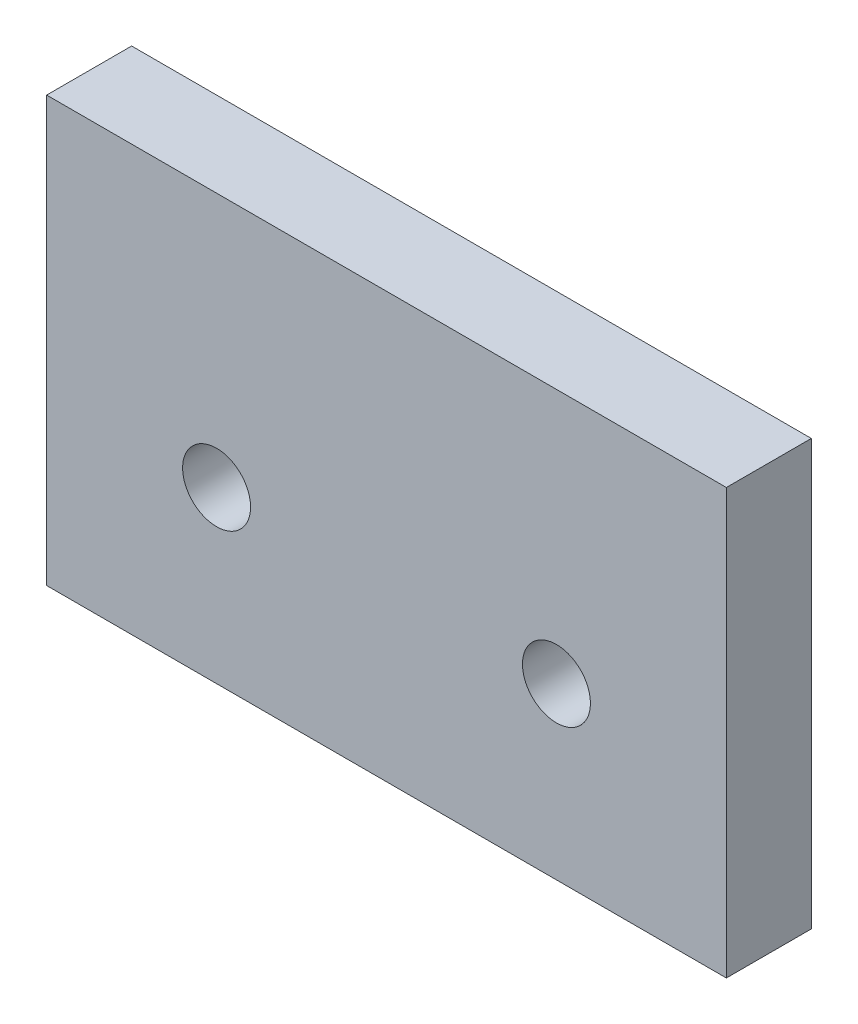
ISO-10303-21;
HEADER;
FILE_DESCRIPTION(('STEP AP214'),'2;1');
FILE_NAME('part.step','',(''),(''),'','','');
FILE_SCHEMA(('AUTOMOTIVE_DESIGN { 1 0 10303 214 1 1 1 1 }'));
ENDSEC;
DATA;
#1=APPLICATION_CONTEXT('core data for automotive mechanical design processes');
#2=APPLICATION_PROTOCOL_DEFINITION('international standard','automotive_design',2000,#1);
#3=PRODUCT_CONTEXT('',#1,'mechanical');
#4=PRODUCT('Part','Part','',(#3));
#5=PRODUCT_RELATED_PRODUCT_CATEGORY('part','',(#4));
#6=PRODUCT_DEFINITION_FORMATION('','',#4);
#7=PRODUCT_DEFINITION_CONTEXT('part definition',#1,'design');
#8=PRODUCT_DEFINITION('design','',#6,#7);
#9=PRODUCT_DEFINITION_SHAPE('','',#8);
#10=(LENGTH_UNIT() NAMED_UNIT(*) SI_UNIT(.MILLI.,.METRE.));
#11=(NAMED_UNIT(*) PLANE_ANGLE_UNIT() SI_UNIT($,.RADIAN.));
#12=(NAMED_UNIT(*) SI_UNIT($,.STERADIAN.) SOLID_ANGLE_UNIT());
#13=UNCERTAINTY_MEASURE_WITH_UNIT(LENGTH_MEASURE(1.E-05),#10,'distance_accuracy_value','');
#14=(GEOMETRIC_REPRESENTATION_CONTEXT(3) GLOBAL_UNCERTAINTY_ASSIGNED_CONTEXT((#13)) GLOBAL_UNIT_ASSIGNED_CONTEXT((#10,
#11,#12)) REPRESENTATION_CONTEXT('',''));
#15=CARTESIAN_POINT('',(0.,0.,0.));
#16=DIRECTION('',(0.,0.,1.));
#17=DIRECTION('',(1.,0.,0.));
#18=AXIS2_PLACEMENT_3D('',#15,#16,#17);
#19=CARTESIAN_POINT('',(25.4,0.,0.));
#20=DIRECTION('',(0.,0.,1.));
#21=DIRECTION('',(1.,0.,0.));
#22=AXIS2_PLACEMENT_3D('',#19,#20,#21);
#23=PLANE('',#22);
#24=CARTESIAN_POINT('',(6.35,3.175,0.));
#25=DIRECTION('',(0.,0.,1.));
#26=DIRECTION('',(1.,0.,0.));
#27=AXIS2_PLACEMENT_3D('',#24,#25,#26);
#28=CIRCLE('',#27,1.27);
#29=CARTESIAN_POINT('',(7.62,3.175,0.));
#30=VERTEX_POINT('',#29);
#31=EDGE_CURVE('E102',#30,#30,#28,.T.);
#32=ORIENTED_EDGE('',*,*,#31,.T.);
#33=EDGE_LOOP('',(#32));
#34=FACE_BOUND('',#33,.T.);
#35=CARTESIAN_POINT('',(19.05,3.175,0.));
#36=DIRECTION('',(0.,0.,1.));
#37=DIRECTION('',(1.,0.,0.));
#38=AXIS2_PLACEMENT_3D('',#35,#36,#37);
#39=CIRCLE('',#38,1.27);
#40=CARTESIAN_POINT('',(20.32,3.175,0.));
#41=VERTEX_POINT('',#40);
#42=EDGE_CURVE('E113',#41,#41,#39,.T.);
#43=ORIENTED_EDGE('',*,*,#42,.T.);
#44=EDGE_LOOP('',(#43));
#45=FACE_BOUND('',#44,.T.);
#46=DIRECTION('',(0.,1.,0.));
#47=VECTOR('',#46,1.);
#48=CARTESIAN_POINT('',(0.,0.,0.));
#49=LINE('',#48,#47);
#50=CARTESIAN_POINT('',(0.,-3.175,0.));
#51=VERTEX_POINT('',#50);
#52=CARTESIAN_POINT('',(0.,12.7,0.));
#53=VERTEX_POINT('',#52);
#54=EDGE_CURVE('E47',#51,#53,#49,.T.);
#55=ORIENTED_EDGE('',*,*,#54,.T.);
#56=DIRECTION('',(-1.,0.,0.));
#57=VECTOR('',#56,1.);
#58=CARTESIAN_POINT('',(25.4,12.7,0.));
#59=LINE('',#58,#57);
#60=CARTESIAN_POINT('',(25.4,12.7,0.));
#61=VERTEX_POINT('',#60);
#62=EDGE_CURVE('E11',#61,#53,#59,.T.);
#63=ORIENTED_EDGE('',*,*,#62,.F.);
#64=DIRECTION('',(0.,1.,0.));
#65=VECTOR('',#64,1.);
#66=CARTESIAN_POINT('',(25.4,0.,0.));
#67=LINE('',#66,#65);
#68=CARTESIAN_POINT('',(25.4,-3.175,0.));
#69=VERTEX_POINT('',#68);
#70=EDGE_CURVE('E76',#69,#61,#67,.T.);
#71=ORIENTED_EDGE('',*,*,#70,.F.);
#72=DIRECTION('',(-1.,0.,0.));
#73=VECTOR('',#72,1.);
#74=CARTESIAN_POINT('',(25.4,-3.175,0.));
#75=LINE('',#74,#73);
#76=EDGE_CURVE('E81',#69,#51,#75,.T.);
#77=ORIENTED_EDGE('',*,*,#76,.T.);
#78=EDGE_LOOP('',(#55,#63,#71,#77));
#79=FACE_BOUND('',#78,.T.);
#80=ADVANCED_FACE('F33',(#34,#45,#79),#23,.F.);
#81=CARTESIAN_POINT('',(25.4,12.7,3.175));
#82=DIRECTION('',(0.,-1.,0.));
#83=DIRECTION('',(0.,0.,-1.));
#84=AXIS2_PLACEMENT_3D('',#81,#82,#83);
#85=PLANE('',#84);
#86=DIRECTION('',(0.,0.,1.));
#87=VECTOR('',#86,1.);
#88=CARTESIAN_POINT('',(0.,12.7,3.175));
#89=LINE('',#88,#87);
#90=CARTESIAN_POINT('',(0.,12.7,3.175));
#91=VERTEX_POINT('',#90);
#92=EDGE_CURVE('E101',#53,#91,#89,.T.);
#93=ORIENTED_EDGE('',*,*,#92,.T.);
#94=DIRECTION('',(-1.,0.,0.));
#95=VECTOR('',#94,1.);
#96=CARTESIAN_POINT('',(25.4,12.7,3.175));
#97=LINE('',#96,#95);
#98=CARTESIAN_POINT('',(25.4,12.7,3.175));
#99=VERTEX_POINT('',#98);
#100=EDGE_CURVE('E40',#99,#91,#97,.T.);
#101=ORIENTED_EDGE('',*,*,#100,.F.);
#102=DIRECTION('',(0.,0.,1.));
#103=VECTOR('',#102,1.);
#104=CARTESIAN_POINT('',(25.4,12.7,3.175));
#105=LINE('',#104,#103);
#106=EDGE_CURVE('E84',#61,#99,#105,.T.);
#107=ORIENTED_EDGE('',*,*,#106,.F.);
#108=ORIENTED_EDGE('',*,*,#62,.T.);
#109=EDGE_LOOP('',(#93,#101,#107,#108));
#110=FACE_BOUND('',#109,.T.);
#111=ADVANCED_FACE('F109',(#110),#85,.F.);
#112=CARTESIAN_POINT('',(25.4,-3.175,3.175));
#113=DIRECTION('',(0.,0.,-1.));
#114=DIRECTION('',(-1.,0.,0.));
#115=AXIS2_PLACEMENT_3D('',#112,#113,#114);
#116=PLANE('',#115);
#117=CARTESIAN_POINT('',(6.35,3.175,3.175));
#118=DIRECTION('',(0.,0.,1.));
#119=DIRECTION('',(1.,0.,0.));
#120=AXIS2_PLACEMENT_3D('',#117,#118,#119);
#121=CIRCLE('',#120,1.27);
#122=CARTESIAN_POINT('',(7.62,3.175,3.175));
#123=VERTEX_POINT('',#122);
#124=EDGE_CURVE('E116',#123,#123,#121,.T.);
#125=ORIENTED_EDGE('',*,*,#124,.F.);
#126=EDGE_LOOP('',(#125));
#127=FACE_BOUND('',#126,.T.);
#128=CARTESIAN_POINT('',(19.05,3.175,3.175));
#129=DIRECTION('',(0.,0.,1.));
#130=DIRECTION('',(1.,0.,0.));
#131=AXIS2_PLACEMENT_3D('',#128,#129,#130);
#132=CIRCLE('',#131,1.27);
#133=CARTESIAN_POINT('',(20.32,3.175,3.175));
#134=VERTEX_POINT('',#133);
#135=EDGE_CURVE('E91',#134,#134,#132,.T.);
#136=ORIENTED_EDGE('',*,*,#135,.F.);
#137=EDGE_LOOP('',(#136));
#138=FACE_BOUND('',#137,.T.);
#139=DIRECTION('',(0.,-1.,0.));
#140=VECTOR('',#139,1.);
#141=CARTESIAN_POINT('',(0.,-3.175,3.175));
#142=LINE('',#141,#140);
#143=CARTESIAN_POINT('',(0.,-3.175,3.175));
#144=VERTEX_POINT('',#143);
#145=EDGE_CURVE('E72',#91,#144,#142,.T.);
#146=ORIENTED_EDGE('',*,*,#145,.T.);
#147=DIRECTION('',(-1.,0.,0.));
#148=VECTOR('',#147,1.);
#149=CARTESIAN_POINT('',(25.4,-3.175,3.175));
#150=LINE('',#149,#148);
#151=CARTESIAN_POINT('',(25.4,-3.175,3.175));
#152=VERTEX_POINT('',#151);
#153=EDGE_CURVE('E94',#152,#144,#150,.T.);
#154=ORIENTED_EDGE('',*,*,#153,.F.);
#155=DIRECTION('',(0.,-1.,0.));
#156=VECTOR('',#155,1.);
#157=CARTESIAN_POINT('',(25.4,-3.175,3.175));
#158=LINE('',#157,#156);
#159=EDGE_CURVE('E56',#99,#152,#158,.T.);
#160=ORIENTED_EDGE('',*,*,#159,.F.);
#161=ORIENTED_EDGE('',*,*,#100,.T.);
#162=EDGE_LOOP('',(#146,#154,#160,#161));
#163=FACE_BOUND('',#162,.T.);
#164=ADVANCED_FACE('F106',(#127,#138,#163),#116,.F.);
#165=CARTESIAN_POINT('',(25.4,-3.175,3.175));
#166=DIRECTION('',(0.,1.,0.));
#167=DIRECTION('',(0.,0.,1.));
#168=AXIS2_PLACEMENT_3D('',#165,#166,#167);
#169=PLANE('',#168);
#170=DIRECTION('',(0.,0.,-1.));
#171=VECTOR('',#170,1.);
#172=CARTESIAN_POINT('',(0.,-3.175,3.175));
#173=LINE('',#172,#171);
#174=EDGE_CURVE('E85',#144,#51,#173,.T.);
#175=ORIENTED_EDGE('',*,*,#174,.T.);
#176=ORIENTED_EDGE('',*,*,#76,.F.);
#177=DIRECTION('',(0.,0.,-1.));
#178=VECTOR('',#177,1.);
#179=CARTESIAN_POINT('',(25.4,-3.175,3.175));
#180=LINE('',#179,#178);
#181=EDGE_CURVE('E90',#152,#69,#180,.T.);
#182=ORIENTED_EDGE('',*,*,#181,.F.);
#183=ORIENTED_EDGE('',*,*,#153,.T.);
#184=EDGE_LOOP('',(#175,#176,#182,#183));
#185=FACE_BOUND('',#184,.T.);
#186=ADVANCED_FACE('F89',(#185),#169,.F.);
#187=CARTESIAN_POINT('',(25.4,0.,0.));
#188=DIRECTION('',(-1.,0.,0.));
#189=DIRECTION('',(0.,0.,1.));
#190=AXIS2_PLACEMENT_3D('',#187,#188,#189);
#191=PLANE('',#190);
#192=ORIENTED_EDGE('',*,*,#181,.T.);
#193=ORIENTED_EDGE('',*,*,#70,.T.);
#194=ORIENTED_EDGE('',*,*,#106,.T.);
#195=ORIENTED_EDGE('',*,*,#159,.T.);
#196=EDGE_LOOP('',(#192,#193,#194,#195));
#197=FACE_BOUND('',#196,.T.);
#198=ADVANCED_FACE('F93',(#197),#191,.F.);
#199=CARTESIAN_POINT('',(0.,0.,0.));
#200=DIRECTION('',(-1.,0.,0.));
#201=DIRECTION('',(0.,0.,1.));
#202=AXIS2_PLACEMENT_3D('',#199,#200,#201);
#203=PLANE('',#202);
#204=ORIENTED_EDGE('',*,*,#54,.F.);
#205=ORIENTED_EDGE('',*,*,#174,.F.);
#206=ORIENTED_EDGE('',*,*,#145,.F.);
#207=ORIENTED_EDGE('',*,*,#92,.F.);
#208=EDGE_LOOP('',(#204,#205,#206,#207));
#209=FACE_BOUND('',#208,.T.);
#210=ADVANCED_FACE('F108',(#209),#203,.T.);
#211=CARTESIAN_POINT('',(19.05,3.175,-22.225));
#212=DIRECTION('',(0.,0.,1.));
#213=DIRECTION('',(1.,0.,0.));
#214=AXIS2_PLACEMENT_3D('',#211,#212,#213);
#215=CYLINDRICAL_SURFACE('',#214,1.27);
#216=ORIENTED_EDGE('',*,*,#135,.T.);
#217=EDGE_LOOP('',(#216));
#218=FACE_BOUND('',#217,.T.);
#219=ORIENTED_EDGE('',*,*,#42,.F.);
#220=EDGE_LOOP('',(#219));
#221=FACE_BOUND('',#220,.T.);
#222=ADVANCED_FACE('F130',(#218,#221),#215,.F.);
#223=CARTESIAN_POINT('',(6.35,3.175,-22.225));
#224=DIRECTION('',(0.,0.,1.));
#225=DIRECTION('',(1.,0.,0.));
#226=AXIS2_PLACEMENT_3D('',#223,#224,#225);
#227=CYLINDRICAL_SURFACE('',#226,1.27);
#228=ORIENTED_EDGE('',*,*,#124,.T.);
#229=EDGE_LOOP('',(#228));
#230=FACE_BOUND('',#229,.T.);
#231=ORIENTED_EDGE('',*,*,#31,.F.);
#232=EDGE_LOOP('',(#231));
#233=FACE_BOUND('',#232,.T.);
#234=ADVANCED_FACE('F122',(#230,#233),#227,.F.);
#235=CLOSED_SHELL('',(#80,#111,#164,#186,#198,#210,#222,#234));
#236=MANIFOLD_SOLID_BREP('B2',#235);
#237=ADVANCED_BREP_SHAPE_REPRESENTATION('',(#18,#236),#14);
#238=SHAPE_DEFINITION_REPRESENTATION(#9,#237);
ENDSEC;
END-ISO-10303-21;
